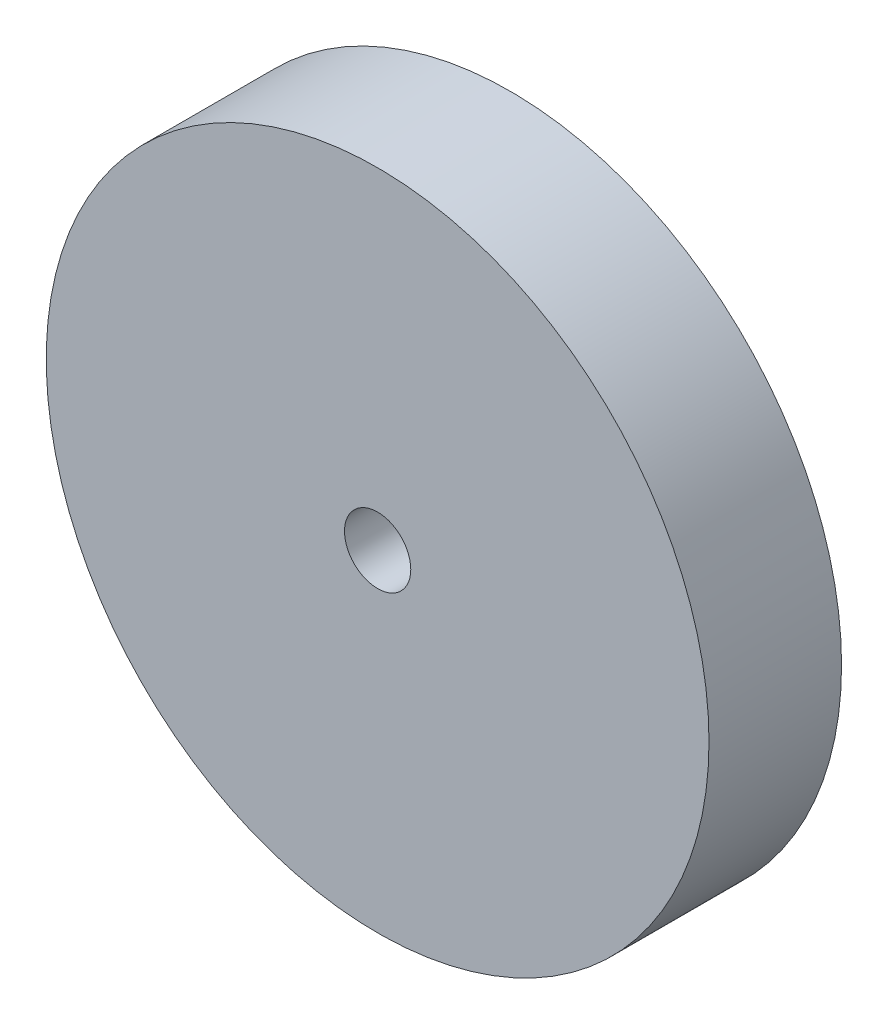
ISO-10303-21;
HEADER;
FILE_DESCRIPTION(('STEP AP214'),'2;1');
FILE_NAME('part.step','',(''),(''),'','','');
FILE_SCHEMA(('AUTOMOTIVE_DESIGN { 1 0 10303 214 1 1 1 1 }'));
ENDSEC;
DATA;
#1=APPLICATION_CONTEXT('core data for automotive mechanical design processes');
#2=APPLICATION_PROTOCOL_DEFINITION('international standard','automotive_design',2000,#1);
#3=PRODUCT_CONTEXT('',#1,'mechanical');
#4=PRODUCT('Part','Part','',(#3));
#5=PRODUCT_RELATED_PRODUCT_CATEGORY('part','',(#4));
#6=PRODUCT_DEFINITION_FORMATION('','',#4);
#7=PRODUCT_DEFINITION_CONTEXT('part definition',#1,'design');
#8=PRODUCT_DEFINITION('design','',#6,#7);
#9=PRODUCT_DEFINITION_SHAPE('','',#8);
#10=(LENGTH_UNIT() NAMED_UNIT(*) SI_UNIT(.MILLI.,.METRE.));
#11=(NAMED_UNIT(*) PLANE_ANGLE_UNIT() SI_UNIT($,.RADIAN.));
#12=(NAMED_UNIT(*) SI_UNIT($,.STERADIAN.) SOLID_ANGLE_UNIT());
#13=UNCERTAINTY_MEASURE_WITH_UNIT(LENGTH_MEASURE(1.E-05),#10,'distance_accuracy_value','');
#14=(GEOMETRIC_REPRESENTATION_CONTEXT(3) GLOBAL_UNCERTAINTY_ASSIGNED_CONTEXT((#13)) GLOBAL_UNIT_ASSIGNED_CONTEXT((#10,
#11,#12)) REPRESENTATION_CONTEXT('',''));
#15=CARTESIAN_POINT('',(0.,0.,0.));
#16=DIRECTION('',(0.,0.,1.));
#17=DIRECTION('',(1.,0.,0.));
#18=AXIS2_PLACEMENT_3D('',#15,#16,#17);
#19=CARTESIAN_POINT('',(11.5000000000013,-184.674624292413,-20.));
#20=DIRECTION('',(0.,0.,1.));
#21=DIRECTION('',(1.,0.,0.));
#22=AXIS2_PLACEMENT_3D('',#19,#20,#21);
#23=CYLINDRICAL_SURFACE('',#22,50.);
#24=CARTESIAN_POINT('',(11.5000000000013,-184.674624292413,-20.));
#25=DIRECTION('',(0.,0.,1.));
#26=DIRECTION('',(1.,0.,0.));
#27=AXIS2_PLACEMENT_3D('',#24,#25,#26);
#28=CIRCLE('',#27,50.);
#29=CARTESIAN_POINT('',(61.5000000000013,-184.674624292413,-20.));
#30=VERTEX_POINT('',#29);
#31=EDGE_CURVE('E10',#30,#30,#28,.T.);
#32=ORIENTED_EDGE('',*,*,#31,.T.);
#33=EDGE_LOOP('',(#32));
#34=FACE_BOUND('',#33,.T.);
#35=CARTESIAN_POINT('',(11.5000000000013,-184.674624292413,0.));
#36=DIRECTION('',(0.,0.,1.));
#37=DIRECTION('',(1.,0.,0.));
#38=AXIS2_PLACEMENT_3D('',#35,#36,#37);
#39=CIRCLE('',#38,50.);
#40=CARTESIAN_POINT('',(61.5000000000013,-184.674624292413,0.));
#41=VERTEX_POINT('',#40);
#42=EDGE_CURVE('E34',#41,#41,#39,.T.);
#43=ORIENTED_EDGE('',*,*,#42,.F.);
#44=EDGE_LOOP('',(#43));
#45=FACE_BOUND('',#44,.T.);
#46=ADVANCED_FACE('F31',(#34,#45),#23,.T.);
#47=CARTESIAN_POINT('',(11.5000000000013,-184.674624292413,-20.));
#48=DIRECTION('',(0.,0.,1.));
#49=DIRECTION('',(1.,0.,0.));
#50=AXIS2_PLACEMENT_3D('',#47,#48,#49);
#51=PLANE('',#50);
#52=CARTESIAN_POINT('',(11.5000000000013,-184.674624292413,-20.));
#53=DIRECTION('',(0.,0.,1.));
#54=DIRECTION('',(1.,0.,0.));
#55=AXIS2_PLACEMENT_3D('',#52,#53,#54);
#56=CIRCLE('',#55,5.);
#57=CARTESIAN_POINT('',(16.5000000000013,-184.674624292413,-20.));
#58=VERTEX_POINT('',#57);
#59=EDGE_CURVE('E41',#58,#58,#56,.T.);
#60=ORIENTED_EDGE('',*,*,#59,.T.);
#61=EDGE_LOOP('',(#60));
#62=FACE_BOUND('',#61,.T.);
#63=ORIENTED_EDGE('',*,*,#31,.F.);
#64=EDGE_LOOP('',(#63));
#65=FACE_BOUND('',#64,.T.);
#66=ADVANCED_FACE('F49',(#62,#65),#51,.F.);
#67=CARTESIAN_POINT('',(11.5000000000013,-184.674624292413,0.));
#68=DIRECTION('',(0.,0.,1.));
#69=DIRECTION('',(1.,0.,0.));
#70=AXIS2_PLACEMENT_3D('',#67,#68,#69);
#71=PLANE('',#70);
#72=CARTESIAN_POINT('',(11.5000000000013,-184.674624292413,0.));
#73=DIRECTION('',(0.,0.,1.));
#74=DIRECTION('',(1.,0.,0.));
#75=AXIS2_PLACEMENT_3D('',#72,#73,#74);
#76=CIRCLE('',#75,5.);
#77=CARTESIAN_POINT('',(16.5000000000013,-184.674624292413,0.));
#78=VERTEX_POINT('',#77);
#79=EDGE_CURVE('E43',#78,#78,#76,.T.);
#80=ORIENTED_EDGE('',*,*,#79,.F.);
#81=EDGE_LOOP('',(#80));
#82=FACE_BOUND('',#81,.T.);
#83=ORIENTED_EDGE('',*,*,#42,.T.);
#84=EDGE_LOOP('',(#83));
#85=FACE_BOUND('',#84,.T.);
#86=ADVANCED_FACE('F55',(#82,#85),#71,.T.);
#87=CARTESIAN_POINT('',(11.5000000000013,-184.674624292413,-20.));
#88=DIRECTION('',(0.,0.,1.));
#89=DIRECTION('',(1.,0.,0.));
#90=AXIS2_PLACEMENT_3D('',#87,#88,#89);
#91=CYLINDRICAL_SURFACE('',#90,5.);
#92=ORIENTED_EDGE('',*,*,#59,.F.);
#93=EDGE_LOOP('',(#92));
#94=FACE_BOUND('',#93,.T.);
#95=ORIENTED_EDGE('',*,*,#79,.T.);
#96=EDGE_LOOP('',(#95));
#97=FACE_BOUND('',#96,.T.);
#98=ADVANCED_FACE('F52',(#94,#97),#91,.F.);
#99=CLOSED_SHELL('',(#46,#66,#86,#98));
#100=MANIFOLD_SOLID_BREP('B2',#99);
#101=ADVANCED_BREP_SHAPE_REPRESENTATION('',(#18,#100),#14);
#102=SHAPE_DEFINITION_REPRESENTATION(#9,#101);
ENDSEC;
END-ISO-10303-21;
